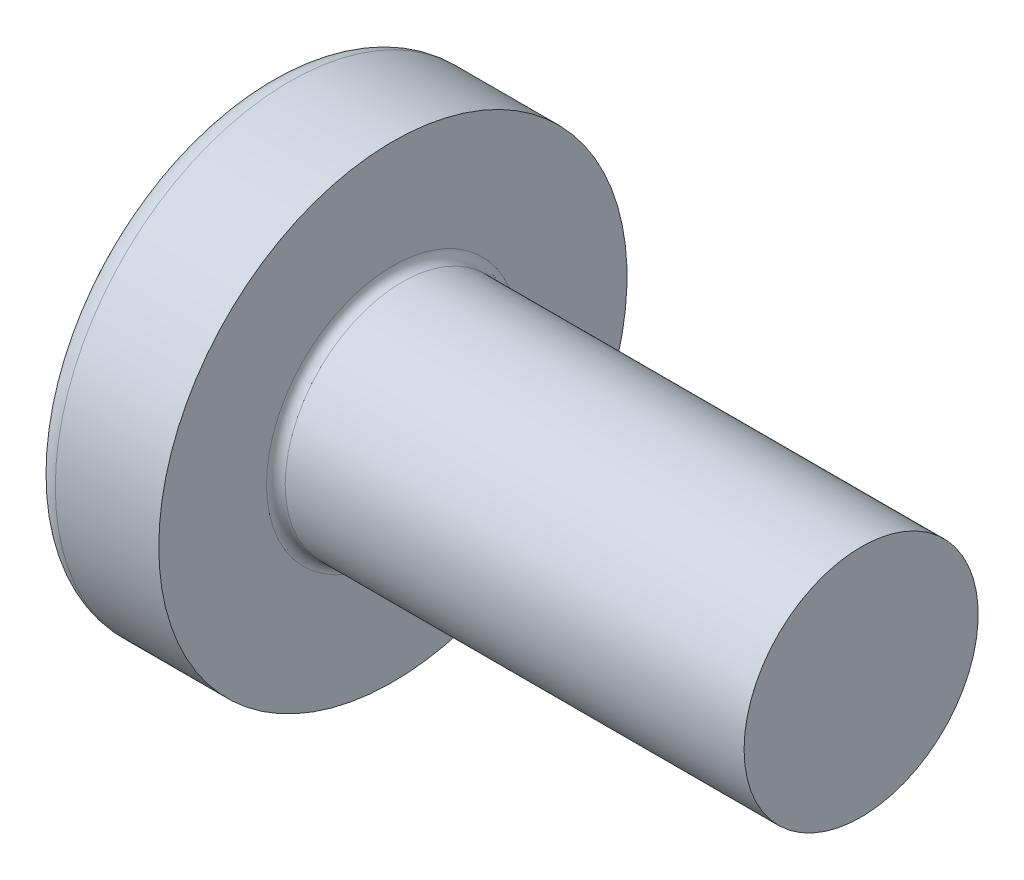
ISO-10303-21;
HEADER;
FILE_DESCRIPTION(('STEP AP214'),'2;1');
FILE_NAME('part.step','',(''),(''),'','','');
FILE_SCHEMA(('AUTOMOTIVE_DESIGN { 1 0 10303 214 1 1 1 1 }'));
ENDSEC;
DATA;
#1=APPLICATION_CONTEXT('core data for automotive mechanical design processes');
#2=APPLICATION_PROTOCOL_DEFINITION('international standard','automotive_design',2000,#1);
#3=PRODUCT_CONTEXT('',#1,'mechanical');
#4=PRODUCT('Part','Part','',(#3));
#5=PRODUCT_RELATED_PRODUCT_CATEGORY('part','',(#4));
#6=PRODUCT_DEFINITION_FORMATION('','',#4);
#7=PRODUCT_DEFINITION_CONTEXT('part definition',#1,'design');
#8=PRODUCT_DEFINITION('design','',#6,#7);
#9=PRODUCT_DEFINITION_SHAPE('','',#8);
#10=(LENGTH_UNIT() NAMED_UNIT(*) SI_UNIT(.MILLI.,.METRE.));
#11=(NAMED_UNIT(*) PLANE_ANGLE_UNIT() SI_UNIT($,.RADIAN.));
#12=(NAMED_UNIT(*) SI_UNIT($,.STERADIAN.) SOLID_ANGLE_UNIT());
#13=UNCERTAINTY_MEASURE_WITH_UNIT(LENGTH_MEASURE(1.E-05),#10,'distance_accuracy_value','');
#14=(GEOMETRIC_REPRESENTATION_CONTEXT(3) GLOBAL_UNCERTAINTY_ASSIGNED_CONTEXT((#13)) GLOBAL_UNIT_ASSIGNED_CONTEXT((#10,
#11,#12)) REPRESENTATION_CONTEXT('',''));
#15=CARTESIAN_POINT('',(0.,0.,0.));
#16=DIRECTION('',(0.,0.,1.));
#17=DIRECTION('',(1.,0.,0.));
#18=AXIS2_PLACEMENT_3D('',#15,#16,#17);
#19=CARTESIAN_POINT('',(4.,0.,0.));
#20=DIRECTION('',(-1.,0.,0.));
#21=DIRECTION('',(0.,1.,0.));
#22=AXIS2_PLACEMENT_3D('',#19,#20,#21);
#23=SPHERICAL_SURFACE('',#22,4.);
#24=CARTESIAN_POINT('',(0.803195914613464,0.,0.));
#25=DIRECTION('',(-1.,0.,0.));
#26=DIRECTION('',(0.,0.,1.));
#27=AXIS2_PLACEMENT_3D('',#24,#25,#26);
#28=CIRCLE('',#27,2.40425531914894);
#29=CARTESIAN_POINT('',(0.803195914613464,0.,2.40425531914894));
#30=VERTEX_POINT('',#29);
#31=EDGE_CURVE('E254',#30,#30,#28,.T.);
#32=ORIENTED_EDGE('',*,*,#31,.T.);
#33=EDGE_LOOP('',(#32));
#34=FACE_BOUND('',#33,.T.);
#35=CARTESIAN_POINT('',(0.0543400780062932,0.,0.));
#36=DIRECTION('',(1.,0.,0.));
#37=DIRECTION('',(0.,0.,-1.));
#38=AXIS2_PLACEMENT_3D('',#35,#36,#37);
#39=CIRCLE('',#38,0.657090389499513);
#40=CARTESIAN_POINT('',(0.054340078006295,-0.369999999999998,-0.54301729251712));
#41=VERTEX_POINT('',#40);
#42=CARTESIAN_POINT('',(0.0543400780062936,-0.543017292517118,-0.37));
#43=VERTEX_POINT('',#42);
#44=EDGE_CURVE('E435',#41,#43,#39,.F.);
#45=ORIENTED_EDGE('',*,*,#44,.F.);
#46=CARTESIAN_POINT('',(4.,-0.37,0.));
#47=DIRECTION('',(0.,1.,0.));
#48=DIRECTION('',(0.,0.,1.));
#49=AXIS2_PLACEMENT_3D('',#46,#47,#48);
#50=CIRCLE('',#49,3.98285073785097);
#51=CARTESIAN_POINT('',(0.201999111211589,-0.369999999999996,-1.19928697514917));
#52=VERTEX_POINT('',#51);
#53=EDGE_CURVE('E334',#52,#41,#50,.T.);
#54=ORIENTED_EDGE('',*,*,#53,.F.);
#55=CARTESIAN_POINT('',(3.72274328891695,0.,0.556091024961063));
#56=DIRECTION('',(0.446197753347362,0.,-0.89493439139848));
#57=DIRECTION('',(-0.89493439139848,0.,-0.446197753347362));
#58=AXIS2_PLACEMENT_3D('',#55,#56,#57);
#59=CIRCLE('',#58,3.95144169742098);
#60=CARTESIAN_POINT('',(0.201999111211589,0.370000000000004,-1.19928697514917));
#61=VERTEX_POINT('',#60);
#62=EDGE_CURVE('E296',#52,#61,#59,.T.);
#63=ORIENTED_EDGE('',*,*,#62,.T.);
#64=CARTESIAN_POINT('',(4.,0.37,0.));
#65=DIRECTION('',(0.,-1.,0.));
#66=DIRECTION('',(0.,0.,-1.));
#67=AXIS2_PLACEMENT_3D('',#64,#65,#66);
#68=CIRCLE('',#67,3.98285073785097);
#69=CARTESIAN_POINT('',(0.0543400780062934,0.370000000000002,-0.543017292517118));
#70=VERTEX_POINT('',#69);
#71=EDGE_CURVE('E367',#70,#61,#68,.T.);
#72=ORIENTED_EDGE('',*,*,#71,.F.);
#73=CARTESIAN_POINT('',(0.0543400780062936,0.543017292517118,-0.37));
#74=VERTEX_POINT('',#73);
#75=EDGE_CURVE('E482',#74,#70,#39,.F.);
#76=ORIENTED_EDGE('',*,*,#75,.F.);
#77=CARTESIAN_POINT('',(4.,0.,-0.37));
#78=DIRECTION('',(0.,0.,1.));
#79=DIRECTION('',(1.,0.,0.));
#80=AXIS2_PLACEMENT_3D('',#77,#78,#79);
#81=CIRCLE('',#80,3.98285073785097);
#82=CARTESIAN_POINT('',(0.201999111211579,1.19928697514914,-0.37));
#83=VERTEX_POINT('',#82);
#84=EDGE_CURVE('E295',#83,#74,#81,.T.);
#85=ORIENTED_EDGE('',*,*,#84,.F.);
#86=CARTESIAN_POINT('',(3.72274328891654,-0.556091024961635,0.));
#87=DIRECTION('',(0.44619775334751,0.894934391398406,0.));
#88=DIRECTION('',(-0.894934391398405,0.44619775334751,0.));
#89=AXIS2_PLACEMENT_3D('',#86,#87,#88);
#90=CIRCLE('',#89,3.95144169742087);
#91=CARTESIAN_POINT('',(0.201999111211579,1.19928697514914,0.37));
#92=VERTEX_POINT('',#91);
#93=EDGE_CURVE('E298',#83,#92,#90,.T.);
#94=ORIENTED_EDGE('',*,*,#93,.T.);
#95=CARTESIAN_POINT('',(4.,0.,0.37));
#96=DIRECTION('',(0.,0.,-1.));
#97=DIRECTION('',(0.,1.,0.));
#98=AXIS2_PLACEMENT_3D('',#95,#96,#97);
#99=CIRCLE('',#98,3.98285073785097);
#100=CARTESIAN_POINT('',(0.0543400780062932,0.543017292517113,0.37));
#101=VERTEX_POINT('',#100);
#102=EDGE_CURVE('E290',#101,#92,#99,.T.);
#103=ORIENTED_EDGE('',*,*,#102,.F.);
#104=CARTESIAN_POINT('',(0.0543400780062942,0.369999999999998,0.54301729251712));
#105=VERTEX_POINT('',#104);
#106=EDGE_CURVE('E461',#105,#101,#39,.F.);
#107=ORIENTED_EDGE('',*,*,#106,.F.);
#108=CARTESIAN_POINT('',(0.201999111211579,0.369999999999996,1.19928697514914));
#109=VERTEX_POINT('',#108);
#110=EDGE_CURVE('E314',#109,#105,#68,.T.);
#111=ORIENTED_EDGE('',*,*,#110,.F.);
#112=CARTESIAN_POINT('',(3.72274328891654,0.,-0.556091024961635));
#113=DIRECTION('',(0.44619775334751,0.,0.894934391398406));
#114=DIRECTION('',(0.894934391398405,0.,-0.44619775334751));
#115=AXIS2_PLACEMENT_3D('',#112,#113,#114);
#116=CIRCLE('',#115,3.95144169742087);
#117=CARTESIAN_POINT('',(0.201999111211579,-0.370000000000004,1.19928697514914));
#118=VERTEX_POINT('',#117);
#119=EDGE_CURVE('E61',#109,#118,#116,.T.);
#120=ORIENTED_EDGE('',*,*,#119,.T.);
#121=CARTESIAN_POINT('',(0.0543400780062943,-0.370000000000002,0.543017292517118));
#122=VERTEX_POINT('',#121);
#123=EDGE_CURVE('E308',#122,#118,#50,.T.);
#124=ORIENTED_EDGE('',*,*,#123,.F.);
#125=CARTESIAN_POINT('',(0.0543400780062932,-0.543017292517113,0.37));
#126=VERTEX_POINT('',#125);
#127=EDGE_CURVE('E469',#126,#122,#39,.F.);
#128=ORIENTED_EDGE('',*,*,#127,.F.);
#129=CARTESIAN_POINT('',(0.201999111211589,-1.19928697514917,0.37));
#130=VERTEX_POINT('',#129);
#131=EDGE_CURVE('E289',#130,#126,#99,.T.);
#132=ORIENTED_EDGE('',*,*,#131,.F.);
#133=CARTESIAN_POINT('',(3.72274328891695,0.556091024961063,0.));
#134=DIRECTION('',(0.446197753347362,-0.89493439139848,0.));
#135=DIRECTION('',(0.89493439139848,0.446197753347362,0.));
#136=AXIS2_PLACEMENT_3D('',#133,#134,#135);
#137=CIRCLE('',#136,3.95144169742098);
#138=CARTESIAN_POINT('',(0.201999111211589,-1.19928697514917,-0.37));
#139=VERTEX_POINT('',#138);
#140=EDGE_CURVE('E284',#130,#139,#137,.T.);
#141=ORIENTED_EDGE('',*,*,#140,.T.);
#142=EDGE_CURVE('E78',#43,#139,#81,.T.);
#143=ORIENTED_EDGE('',*,*,#142,.F.);
#144=EDGE_LOOP('',(#45,#54,#63,#72,#76,#85,#94,#103,#107,#111,#120,#124,#128,#132,#141,#143));
#145=FACE_BOUND('',#144,.T.);
#146=ADVANCED_FACE('F47',(#34,#145),#23,.T.);
#147=CARTESIAN_POINT('',(1.5,0.5521277129875,-0.37));
#148=DIRECTION('',(0.,0.,1.));
#149=DIRECTION('',(1.,0.,0.));
#150=AXIS2_PLACEMENT_3D('',#147,#148,#149);
#151=PLANE('',#150);
#152=ORIENTED_EDGE('',*,*,#84,.T.);
#153=CARTESIAN_POINT('',(-0.98410748766867,0.628943903399942,-0.37));
#154=CARTESIAN_POINT('',(-0.783603343008974,0.612669947295736,-0.37));
#155=CARTESIAN_POINT('',(-0.583110931104086,0.596248129681141,-0.37));
#156=CARTESIAN_POINT('',(-0.182155788452108,0.562989164841715,-0.37));
#157=CARTESIAN_POINT('',(0.0183069414735531,0.546152007726029,-0.37));
#158=CARTESIAN_POINT('',(0.419186928470486,0.511943523152247,-0.37));
#159=CARTESIAN_POINT('',(0.61960418554543,0.4945721957373,-0.37));
#160=CARTESIAN_POINT('',(1.02037173794706,0.459102589125901,-0.37));
#161=CARTESIAN_POINT('',(1.22072203423871,0.441004320904958,-0.37));
#162=CARTESIAN_POINT('',(1.53631168775258,0.411665443099266,-0.37));
#163=CARTESIAN_POINT('',(1.65158348734209,0.400774467003839,-0.37));
#164=CARTESIAN_POINT('',(1.88208360561815,0.378547148308018,-0.37));
#165=CARTESIAN_POINT('',(1.99731192452822,0.367210808029326,-0.37));
#166=CARTESIAN_POINT('',(2.22771614129237,0.343963614894723,-0.37));
#167=CARTESIAN_POINT('',(2.34289203669079,0.332052737461392,-0.37));
#168=CARTESIAN_POINT('',(2.5731581934851,0.30741320876737,-0.37));
#169=CARTESIAN_POINT('',(2.68824845325022,0.294684542317204,-0.37));
#170=CARTESIAN_POINT('',(2.80327961663798,0.281425340988554,-0.37));
#171=B_SPLINE_CURVE_WITH_KNOTS('',3,(#153,#154,#155,#156,#157,#158,#159,#160,#161,#162,#163,
#164,#165,#166,#167,#168,#169,#170),.UNSPECIFIED.,.F.,.F.,(4,2,2,2,2,2,2,2,4),(0.,
0.603490856265068,1.20699609790343,1.81050129079257,2.41399737525255,2.7613521432415,
3.1087051006963,3.45607293033825,3.80344721379854),.UNSPECIFIED.);
#172=CARTESIAN_POINT('',(1.5,0.415013252800437,-0.370000000000001));
#173=VERTEX_POINT('',#172);
#174=EDGE_CURVE('E493',#74,#173,#171,.T.);
#175=ORIENTED_EDGE('',*,*,#174,.T.);
#176=DIRECTION('',(0.,1.,0.));
#177=VECTOR('',#176,1.);
#178=CARTESIAN_POINT('',(1.5,-0.552127712987811,-0.37));
#179=LINE('',#178,#177);
#180=CARTESIAN_POINT('',(1.5,0.5521277129875,-0.37));
#181=VERTEX_POINT('',#180);
#182=EDGE_CURVE('E410',#173,#181,#179,.T.);
#183=ORIENTED_EDGE('',*,*,#182,.T.);
#184=DIRECTION('',(0.894934391398406,-0.44619775334751,0.));
#185=VECTOR('',#184,1.);
#186=CARTESIAN_POINT('',(0.,1.3,-0.37));
#187=LINE('',#186,#185);
#188=EDGE_CURVE('E258',#83,#181,#187,.T.);
#189=ORIENTED_EDGE('',*,*,#188,.F.);
#190=EDGE_LOOP('',(#152,#175,#183,#189));
#191=FACE_BOUND('',#190,.T.);
#192=ADVANCED_FACE('F206',(#191),#151,.T.);
#193=CARTESIAN_POINT('',(1.5,-0.552127712987811,-0.37));
#194=VERTEX_POINT('',#193);
#195=CARTESIAN_POINT('',(1.5,-0.415013252800437,-0.370000000000001));
#196=VERTEX_POINT('',#195);
#197=EDGE_CURVE('E270',#194,#196,#179,.T.);
#198=ORIENTED_EDGE('',*,*,#197,.T.);
#199=CARTESIAN_POINT('',(-0.98410748766867,-0.628943903399942,-0.37));
#200=CARTESIAN_POINT('',(-0.783603343008974,-0.612669947295736,-0.37));
#201=CARTESIAN_POINT('',(-0.583110931104087,-0.596248129681141,-0.37));
#202=CARTESIAN_POINT('',(-0.182155788452109,-0.562989164841715,-0.37));
#203=CARTESIAN_POINT('',(0.0183069414735524,-0.546152007726029,-0.37));
#204=CARTESIAN_POINT('',(0.419186928470486,-0.511943523152247,-0.37));
#205=CARTESIAN_POINT('',(0.619604185545429,-0.4945721957373,-0.37));
#206=CARTESIAN_POINT('',(1.02037173794705,-0.4591025891259,-0.37));
#207=CARTESIAN_POINT('',(1.22072203423871,-0.441004320904958,-0.37));
#208=CARTESIAN_POINT('',(1.53631168775258,-0.411665443099266,-0.37));
#209=CARTESIAN_POINT('',(1.65158348734209,-0.400774467003839,-0.37));
#210=CARTESIAN_POINT('',(1.88208360561815,-0.378547148308018,-0.37));
#211=CARTESIAN_POINT('',(1.99731192452822,-0.367210808029325,-0.37));
#212=CARTESIAN_POINT('',(2.22771614129237,-0.343963614894723,-0.37));
#213=CARTESIAN_POINT('',(2.34289203669079,-0.332052737461392,-0.37));
#214=CARTESIAN_POINT('',(2.5731581934851,-0.30741320876737,-0.37));
#215=CARTESIAN_POINT('',(2.68824845325022,-0.294684542317204,-0.37));
#216=CARTESIAN_POINT('',(2.80327961663798,-0.281425340988554,-0.37));
#217=B_SPLINE_CURVE_WITH_KNOTS('',3,(#199,#200,#201,#202,#203,#204,#205,#206,#207,#208,#209,
#210,#211,#212,#213,#214,#215,#216),.UNSPECIFIED.,.F.,.F.,(4,2,2,2,2,2,2,2,4),(0.,
0.603490856265068,1.20699609790343,1.81050129079257,2.41399737525255,2.7613521432415,
3.1087051006963,3.45607293033825,3.80344721379854),.UNSPECIFIED.);
#218=EDGE_CURVE('E505',#196,#43,#217,.F.);
#219=ORIENTED_EDGE('',*,*,#218,.T.);
#220=ORIENTED_EDGE('',*,*,#142,.T.);
#221=DIRECTION('',(0.89493439139848,0.446197753347362,0.));
#222=VECTOR('',#221,1.);
#223=CARTESIAN_POINT('',(0.,-1.3,-0.37));
#224=LINE('',#223,#222);
#225=EDGE_CURVE('E372',#139,#194,#224,.T.);
#226=ORIENTED_EDGE('',*,*,#225,.T.);
#227=EDGE_LOOP('',(#198,#219,#220,#226));
#228=FACE_BOUND('',#227,.T.);
#229=ADVANCED_FACE('F216',(#228),#151,.T.);
#230=CARTESIAN_POINT('',(1.5,-0.552127712987811,0.37));
#231=DIRECTION('',(0.,0.,-1.));
#232=DIRECTION('',(0.,1.,0.));
#233=AXIS2_PLACEMENT_3D('',#230,#231,#232);
#234=PLANE('',#233);
#235=DIRECTION('',(0.,-1.,0.));
#236=VECTOR('',#235,1.);
#237=CARTESIAN_POINT('',(1.5,0.5521277129875,0.37));
#238=LINE('',#237,#236);
#239=CARTESIAN_POINT('',(1.5,0.5521277129875,0.37));
#240=VERTEX_POINT('',#239);
#241=CARTESIAN_POINT('',(1.5,0.415013252800437,0.370000000000001));
#242=VERTEX_POINT('',#241);
#243=EDGE_CURVE('E383',#240,#242,#238,.T.);
#244=ORIENTED_EDGE('',*,*,#243,.T.);
#245=CARTESIAN_POINT('',(-0.984107487670368,0.62894390340008,0.37));
#246=CARTESIAN_POINT('',(-0.783603343010499,0.61266994729586,0.37));
#247=CARTESIAN_POINT('',(-0.583110931105436,0.596248129681252,0.37));
#248=CARTESIAN_POINT('',(-0.18215578845311,0.562989164841799,0.37));
#249=CARTESIAN_POINT('',(0.0183069414727262,0.5461520077261,0.37));
#250=CARTESIAN_POINT('',(0.419186928470242,0.511943523152269,0.37));
#251=CARTESIAN_POINT('',(0.619604185545593,0.494572195737286,0.37));
#252=CARTESIAN_POINT('',(1.02037173794803,0.459102589125813,0.37));
#253=CARTESIAN_POINT('',(1.22072203424009,0.441004320904832,0.37));
#254=CARTESIAN_POINT('',(1.53631168775438,0.411665443099097,0.37));
#255=CARTESIAN_POINT('',(1.65158348734388,0.400774467003668,0.37));
#256=CARTESIAN_POINT('',(1.88208360561995,0.378547148307843,0.37));
#257=CARTESIAN_POINT('',(1.99731192453001,0.367210808029148,0.37));
#258=CARTESIAN_POINT('',(2.22771614129417,0.343963614894539,0.37));
#259=CARTESIAN_POINT('',(2.34289203669258,0.332052737461204,0.37));
#260=CARTESIAN_POINT('',(2.57315819348689,0.307413208767174,0.37));
#261=CARTESIAN_POINT('',(2.68824845325201,0.294684542317003,0.37));
#262=CARTESIAN_POINT('',(2.80327961663977,0.281425340988347,0.37));
#263=B_SPLINE_CURVE_WITH_KNOTS('',3,(#245,#246,#247,#248,#249,#250,#251,#252,#253,#254,#255,
#256,#257,#258,#259,#260,#261,#262),.UNSPECIFIED.,.F.,.F.,(4,2,2,2,2,2,2,2,4),(0.,
0.603490856265592,1.20699609790448,1.81050129079485,2.41399737525605,2.76135214324501,
3.1087051006998,3.45607293034176,3.80344721380205),.UNSPECIFIED.);
#264=EDGE_CURVE('E458',#242,#101,#263,.F.);
#265=ORIENTED_EDGE('',*,*,#264,.T.);
#266=ORIENTED_EDGE('',*,*,#102,.T.);
#267=DIRECTION('',(0.894934391398405,-0.44619775334751,0.));
#268=VECTOR('',#267,1.);
#269=CARTESIAN_POINT('',(0.,1.3,0.37));
#270=LINE('',#269,#268);
#271=EDGE_CURVE('E264',#92,#240,#270,.T.);
#272=ORIENTED_EDGE('',*,*,#271,.T.);
#273=EDGE_LOOP('',(#244,#265,#266,#272));
#274=FACE_BOUND('',#273,.T.);
#275=ADVANCED_FACE('F583',(#274),#234,.T.);
#276=ORIENTED_EDGE('',*,*,#131,.T.);
#277=CARTESIAN_POINT('',(-0.984107487670367,-0.62894390340008,0.37));
#278=CARTESIAN_POINT('',(-0.783603343010497,-0.61266994729586,0.37));
#279=CARTESIAN_POINT('',(-0.583110931105435,-0.596248129681252,0.37));
#280=CARTESIAN_POINT('',(-0.182155788453109,-0.562989164841799,0.37));
#281=CARTESIAN_POINT('',(0.018306941472727,-0.546152007726099,0.37));
#282=CARTESIAN_POINT('',(0.419186928470243,-0.511943523152269,0.37));
#283=CARTESIAN_POINT('',(0.619604185545594,-0.494572195737286,0.37));
#284=CARTESIAN_POINT('',(1.02037173794803,-0.459102589125813,0.37));
#285=CARTESIAN_POINT('',(1.2207220342401,-0.441004320904832,0.37));
#286=CARTESIAN_POINT('',(1.53631168775438,-0.411665443099097,0.37));
#287=CARTESIAN_POINT('',(1.65158348734389,-0.400774467003668,0.37));
#288=CARTESIAN_POINT('',(1.88208360561995,-0.378547148307843,0.37));
#289=CARTESIAN_POINT('',(1.99731192453001,-0.367210808029148,0.37));
#290=CARTESIAN_POINT('',(2.22771614129417,-0.343963614894539,0.37));
#291=CARTESIAN_POINT('',(2.34289203669258,-0.332052737461204,0.37));
#292=CARTESIAN_POINT('',(2.57315819348689,-0.307413208767175,0.37));
#293=CARTESIAN_POINT('',(2.68824845325201,-0.294684542317003,0.37));
#294=CARTESIAN_POINT('',(2.80327961663977,-0.281425340988347,0.37));
#295=B_SPLINE_CURVE_WITH_KNOTS('',3,(#277,#278,#279,#280,#281,#282,#283,#284,#285,#286,#287,
#288,#289,#290,#291,#292,#293,#294),.UNSPECIFIED.,.F.,.F.,(4,2,2,2,2,2,2,2,4),(0.,
0.603490856265593,1.20699609790448,1.81050129079485,2.41399737525605,2.76135214324501,
3.1087051006998,3.45607293034176,3.80344721380205),.UNSPECIFIED.);
#296=CARTESIAN_POINT('',(1.5,-0.415013252800437,0.370000000000001));
#297=VERTEX_POINT('',#296);
#298=EDGE_CURVE('E472',#126,#297,#295,.T.);
#299=ORIENTED_EDGE('',*,*,#298,.T.);
#300=CARTESIAN_POINT('',(1.5,-0.552127712987811,0.37));
#301=VERTEX_POINT('',#300);
#302=EDGE_CURVE('E389',#297,#301,#238,.T.);
#303=ORIENTED_EDGE('',*,*,#302,.T.);
#304=DIRECTION('',(0.89493439139848,0.446197753347362,0.));
#305=VECTOR('',#304,1.);
#306=CARTESIAN_POINT('',(0.,-1.3,0.37));
#307=LINE('',#306,#305);
#308=EDGE_CURVE('E376',#130,#301,#307,.T.);
#309=ORIENTED_EDGE('',*,*,#308,.F.);
#310=EDGE_LOOP('',(#276,#299,#303,#309));
#311=FACE_BOUND('',#310,.T.);
#312=ADVANCED_FACE('F691',(#311),#234,.T.);
#313=CARTESIAN_POINT('',(0.,1.3,0.37));
#314=DIRECTION('',(0.44619775334751,0.894934391398406,0.));
#315=DIRECTION('',(-0.894934391398405,0.44619775334751,0.));
#316=AXIS2_PLACEMENT_3D('',#313,#314,#315);
#317=PLANE('',#316);
#318=CARTESIAN_POINT('',(2.47007552564168,0.0684659783631693,0.));
#319=DIRECTION('',(0.44619775334751,0.894934391398406,0.));
#320=DIRECTION('',(-0.894934391398406,0.44619775334751,0.));
#321=AXIS2_PLACEMENT_3D('',#318,#319,#320);
#322=ELLIPSE('',#321,1.0940568559234,0.483340636970325);
#323=CARTESIAN_POINT('',(1.5,0.552127712987502,0.0655056375527411));
#324=VERTEX_POINT('',#323);
#325=CARTESIAN_POINT('',(1.5,0.552127712987502,-0.0655056375527409));
#326=VERTEX_POINT('',#325);
#327=EDGE_CURVE('E337',#324,#326,#322,.F.);
#328=ORIENTED_EDGE('',*,*,#327,.F.);
#329=DIRECTION('',(0.,0.,-1.));
#330=VECTOR('',#329,1.);
#331=CARTESIAN_POINT('',(1.5,0.5521277129875,0.37));
#332=LINE('',#331,#330);
#333=EDGE_CURVE('E386',#240,#324,#332,.T.);
#334=ORIENTED_EDGE('',*,*,#333,.F.);
#335=ORIENTED_EDGE('',*,*,#271,.F.);
#336=ORIENTED_EDGE('',*,*,#93,.F.);
#337=ORIENTED_EDGE('',*,*,#188,.T.);
#338=EDGE_CURVE('E395',#326,#181,#332,.T.);
#339=ORIENTED_EDGE('',*,*,#338,.F.);
#340=EDGE_LOOP('',(#328,#334,#335,#336,#337,#339));
#341=FACE_BOUND('',#340,.T.);
#342=ADVANCED_FACE('F584',(#341),#317,.F.);
#343=CARTESIAN_POINT('',(0.,-1.3,-0.37));
#344=DIRECTION('',(0.446197753347362,-0.89493439139848,0.));
#345=DIRECTION('',(0.89493439139848,0.446197753347362,0.));
#346=AXIS2_PLACEMENT_3D('',#343,#344,#345);
#347=PLANE('',#346);
#348=CARTESIAN_POINT('',(2.47007552564267,-0.0684659783631887,0.));
#349=DIRECTION('',(0.446197753347362,-0.89493439139848,0.));
#350=DIRECTION('',(-0.89493439139848,-0.446197753347362,0.));
#351=AXIS2_PLACEMENT_3D('',#348,#349,#350);
#352=ELLIPSE('',#351,1.0940568559236,0.483340636970252);
#353=CARTESIAN_POINT('',(1.5,-0.552127712987812,-0.0655056375501222));
#354=VERTEX_POINT('',#353);
#355=CARTESIAN_POINT('',(1.5,-0.552127712987812,0.0655056375501221));
#356=VERTEX_POINT('',#355);
#357=EDGE_CURVE('E460',#354,#356,#352,.F.);
#358=ORIENTED_EDGE('',*,*,#357,.F.);
#359=DIRECTION('',(0.,0.,1.));
#360=VECTOR('',#359,1.);
#361=CARTESIAN_POINT('',(1.5,-0.552127712987811,-0.37));
#362=LINE('',#361,#360);
#363=EDGE_CURVE('E380',#194,#354,#362,.T.);
#364=ORIENTED_EDGE('',*,*,#363,.F.);
#365=ORIENTED_EDGE('',*,*,#225,.F.);
#366=ORIENTED_EDGE('',*,*,#140,.F.);
#367=ORIENTED_EDGE('',*,*,#308,.T.);
#368=EDGE_CURVE('E384',#356,#301,#362,.T.);
#369=ORIENTED_EDGE('',*,*,#368,.F.);
#370=EDGE_LOOP('',(#358,#364,#365,#366,#367,#369));
#371=FACE_BOUND('',#370,.T.);
#372=ADVANCED_FACE('F679',(#371),#347,.F.);
#373=CARTESIAN_POINT('',(1.5,0.5521277129875,-0.37));
#374=DIRECTION('',(-1.,0.,0.));
#375=DIRECTION('',(0.,0.,1.));
#376=AXIS2_PLACEMENT_3D('',#373,#374,#375);
#377=PLANE('',#376);
#378=DIRECTION('',(0.,1.,0.));
#379=VECTOR('',#378,1.);
#380=CARTESIAN_POINT('',(1.5,-0.370000000000002,0.552127712987499));
#381=LINE('',#380,#379);
#382=CARTESIAN_POINT('',(1.5,-0.370000000000002,0.552127712987499));
#383=VERTEX_POINT('',#382);
#384=CARTESIAN_POINT('',(1.5,-0.0655056375527541,0.5521277129875));
#385=VERTEX_POINT('',#384);
#386=EDGE_CURVE('E356',#383,#385,#381,.T.);
#387=ORIENTED_EDGE('',*,*,#386,.T.);
#388=CARTESIAN_POINT('',(1.5,0.,0.));
#389=DIRECTION('',(-1.,0.,0.));
#390=DIRECTION('',(0.,0.,1.));
#391=AXIS2_PLACEMENT_3D('',#388,#389,#390);
#392=CIRCLE('',#391,0.556);
#393=CARTESIAN_POINT('',(1.5,-0.370000000000001,0.415013252800436));
#394=VERTEX_POINT('',#393);
#395=EDGE_CURVE('E565',#394,#385,#392,.T.);
#396=ORIENTED_EDGE('',*,*,#395,.F.);
#397=DIRECTION('',(0.,0.,-1.));
#398=VECTOR('',#397,1.);
#399=CARTESIAN_POINT('',(1.5,-0.370000000000002,0.552127712987499));
#400=LINE('',#399,#398);
#401=EDGE_CURVE('E353',#383,#394,#400,.T.);
#402=ORIENTED_EDGE('',*,*,#401,.F.);
#403=EDGE_LOOP('',(#387,#396,#402));
#404=FACE_BOUND('',#403,.T.);
#405=ADVANCED_FACE('F667',(#404),#377,.T.);
#406=ORIENTED_EDGE('',*,*,#302,.F.);
#407=EDGE_CURVE('E552',#356,#297,#392,.T.);
#408=ORIENTED_EDGE('',*,*,#407,.F.);
#409=ORIENTED_EDGE('',*,*,#368,.T.);
#410=EDGE_LOOP('',(#406,#408,#409));
#411=FACE_BOUND('',#410,.T.);
#412=ADVANCED_FACE('F662',(#411),#377,.T.);
#413=ORIENTED_EDGE('',*,*,#363,.T.);
#414=EDGE_CURVE('E548',#196,#354,#392,.T.);
#415=ORIENTED_EDGE('',*,*,#414,.F.);
#416=ORIENTED_EDGE('',*,*,#197,.F.);
#417=EDGE_LOOP('',(#413,#415,#416));
#418=FACE_BOUND('',#417,.T.);
#419=ADVANCED_FACE('F652',(#418),#377,.T.);
#420=CARTESIAN_POINT('',(1.5,-0.369999999999998,-0.415013252800437));
#421=VERTEX_POINT('',#420);
#422=CARTESIAN_POINT('',(1.5,-0.369999999999998,-0.552127712987812));
#423=VERTEX_POINT('',#422);
#424=EDGE_CURVE('E359',#421,#423,#400,.T.);
#425=ORIENTED_EDGE('',*,*,#424,.F.);
#426=CARTESIAN_POINT('',(1.5,-0.0655056375501301,-0.552127712987811));
#427=VERTEX_POINT('',#426);
#428=EDGE_CURVE('E73',#427,#421,#392,.T.);
#429=ORIENTED_EDGE('',*,*,#428,.F.);
#430=DIRECTION('',(0.,-1.,0.));
#431=VECTOR('',#430,1.);
#432=CARTESIAN_POINT('',(1.5,0.370000000000002,-0.55212771298781));
#433=LINE('',#432,#431);
#434=EDGE_CURVE('E352',#427,#423,#433,.T.);
#435=ORIENTED_EDGE('',*,*,#434,.T.);
#436=EDGE_LOOP('',(#425,#429,#435));
#437=FACE_BOUND('',#436,.T.);
#438=ADVANCED_FACE('F644',(#437),#377,.T.);
#439=CARTESIAN_POINT('',(1.5,0.370000000000002,-0.55212771298781));
#440=VERTEX_POINT('',#439);
#441=CARTESIAN_POINT('',(1.5,0.065505637550134,-0.552127712987811));
#442=VERTEX_POINT('',#441);
#443=EDGE_CURVE('E347',#440,#442,#433,.T.);
#444=ORIENTED_EDGE('',*,*,#443,.T.);
#445=CARTESIAN_POINT('',(1.5,0.370000000000001,-0.415013252800436));
#446=VERTEX_POINT('',#445);
#447=EDGE_CURVE('E534',#446,#442,#392,.T.);
#448=ORIENTED_EDGE('',*,*,#447,.F.);
#449=DIRECTION('',(0.,0.,1.));
#450=VECTOR('',#449,1.);
#451=CARTESIAN_POINT('',(1.5,0.370000000000002,-0.55212771298781));
#452=LINE('',#451,#450);
#453=EDGE_CURVE('E361',#440,#446,#452,.T.);
#454=ORIENTED_EDGE('',*,*,#453,.F.);
#455=EDGE_LOOP('',(#444,#448,#454));
#456=FACE_BOUND('',#455,.T.);
#457=ADVANCED_FACE('F640',(#456),#377,.T.);
#458=ORIENTED_EDGE('',*,*,#182,.F.);
#459=EDGE_CURVE('E526',#326,#173,#392,.T.);
#460=ORIENTED_EDGE('',*,*,#459,.F.);
#461=ORIENTED_EDGE('',*,*,#338,.T.);
#462=EDGE_LOOP('',(#458,#460,#461));
#463=FACE_BOUND('',#462,.T.);
#464=ADVANCED_FACE('F627',(#463),#377,.T.);
#465=ORIENTED_EDGE('',*,*,#333,.T.);
#466=EDGE_CURVE('E518',#242,#324,#392,.T.);
#467=ORIENTED_EDGE('',*,*,#466,.F.);
#468=ORIENTED_EDGE('',*,*,#243,.F.);
#469=EDGE_LOOP('',(#465,#467,#468));
#470=FACE_BOUND('',#469,.T.);
#471=ADVANCED_FACE('F622',(#470),#377,.T.);
#472=CARTESIAN_POINT('',(1.5,0.369999999999998,0.552127712987501));
#473=DIRECTION('',(0.,-1.,0.));
#474=DIRECTION('',(1.,0.,0.));
#475=AXIS2_PLACEMENT_3D('',#472,#473,#474);
#476=PLANE('',#475);
#477=ORIENTED_EDGE('',*,*,#110,.T.);
#478=CARTESIAN_POINT('',(-0.98410748766867,0.369999999999998,0.628943903399943));
#479=CARTESIAN_POINT('',(-0.783603343008974,0.369999999999998,0.612669947295737));
#480=CARTESIAN_POINT('',(-0.583110931104087,0.369999999999998,0.596248129681142));
#481=CARTESIAN_POINT('',(-0.182155788452109,0.369999999999998,0.562989164841716));
#482=CARTESIAN_POINT('',(0.0183069414735524,0.369999999999998,0.546152007726031));
#483=CARTESIAN_POINT('',(0.419186928470486,0.369999999999998,0.511943523152249));
#484=CARTESIAN_POINT('',(0.619604185545429,0.369999999999998,0.494572195737301));
#485=CARTESIAN_POINT('',(1.02037173794705,0.369999999999998,0.459102589125902));
#486=CARTESIAN_POINT('',(1.22072203423871,0.369999999999998,0.44100432090496));
#487=CARTESIAN_POINT('',(1.53631168775258,0.369999999999999,0.411665443099267));
#488=CARTESIAN_POINT('',(1.65158348734209,0.369999999999999,0.40077446700384));
#489=CARTESIAN_POINT('',(1.88208360561815,0.369999999999999,0.37854714830802));
#490=CARTESIAN_POINT('',(1.99731192452821,0.369999999999999,0.367210808029327));
#491=CARTESIAN_POINT('',(2.22771614129237,0.369999999999999,0.343963614894724));
#492=CARTESIAN_POINT('',(2.34289203669079,0.369999999999999,0.332052737461393));
#493=CARTESIAN_POINT('',(2.5731581934851,0.369999999999999,0.307413208767372));
#494=CARTESIAN_POINT('',(2.68824845325022,0.369999999999999,0.294684542317205));
#495=CARTESIAN_POINT('',(2.80327961663798,0.369999999999999,0.281425340988555));
#496=B_SPLINE_CURVE_WITH_KNOTS('',3,(#478,#479,#480,#481,#482,#483,#484,#485,#486,#487,#488,
#489,#490,#491,#492,#493,#494,#495),.UNSPECIFIED.,.F.,.F.,(4,2,2,2,2,2,2,2,4),(0.,
0.603490856265068,1.20699609790343,1.81050129079257,2.41399737525255,2.7613521432415,
3.1087051006963,3.45607293033825,3.80344721379854),.UNSPECIFIED.);
#497=CARTESIAN_POINT('',(1.5,0.369999999999999,0.415013252800439));
#498=VERTEX_POINT('',#497);
#499=EDGE_CURVE('E468',#105,#498,#496,.T.);
#500=ORIENTED_EDGE('',*,*,#499,.T.);
#501=CARTESIAN_POINT('',(1.5,0.369999999999998,0.552127712987501));
#502=VERTEX_POINT('',#501);
#503=EDGE_CURVE('E328',#498,#502,#452,.T.);
#504=ORIENTED_EDGE('',*,*,#503,.T.);
#505=DIRECTION('',(0.894934391398406,0.,-0.44619775334751));
#506=VECTOR('',#505,1.);
#507=CARTESIAN_POINT('',(0.,0.369999999999995,1.3));
#508=LINE('',#507,#506);
#509=EDGE_CURVE('E323',#109,#502,#508,.T.);
#510=ORIENTED_EDGE('',*,*,#509,.F.);
#511=EDGE_LOOP('',(#477,#500,#504,#510));
#512=FACE_BOUND('',#511,.T.);
#513=ADVANCED_FACE('F321',(#512),#476,.T.);
#514=CARTESIAN_POINT('',(1.5,-0.369999999999998,-0.552127712987812));
#515=DIRECTION('',(0.,1.,0.));
#516=DIRECTION('',(0.,0.,1.));
#517=AXIS2_PLACEMENT_3D('',#514,#515,#516);
#518=PLANE('',#517);
#519=ORIENTED_EDGE('',*,*,#401,.T.);
#520=CARTESIAN_POINT('',(-0.98410748766867,-0.370000000000002,0.62894390339994));
#521=CARTESIAN_POINT('',(-0.783603343008974,-0.370000000000002,0.612669947295735));
#522=CARTESIAN_POINT('',(-0.583110931104086,-0.370000000000002,0.59624812968114));
#523=CARTESIAN_POINT('',(-0.182155788452109,-0.370000000000002,0.562989164841714));
#524=CARTESIAN_POINT('',(0.0183069414735528,-0.370000000000002,0.546152007726028));
#525=CARTESIAN_POINT('',(0.419186928470486,-0.370000000000002,0.511943523152246));
#526=CARTESIAN_POINT('',(0.61960418554543,-0.370000000000002,0.494572195737299));
#527=CARTESIAN_POINT('',(1.02037173794706,-0.370000000000001,0.459102589125899));
#528=CARTESIAN_POINT('',(1.22072203423871,-0.370000000000001,0.441004320904957));
#529=CARTESIAN_POINT('',(1.53631168775258,-0.370000000000001,0.411665443099264));
#530=CARTESIAN_POINT('',(1.65158348734209,-0.370000000000001,0.400774467003838));
#531=CARTESIAN_POINT('',(1.88208360561815,-0.370000000000001,0.378547148308017));
#532=CARTESIAN_POINT('',(1.99731192452822,-0.370000000000001,0.367210808029324));
#533=CARTESIAN_POINT('',(2.22771614129237,-0.370000000000001,0.343963614894722));
#534=CARTESIAN_POINT('',(2.34289203669079,-0.370000000000001,0.33205273746139));
#535=CARTESIAN_POINT('',(2.5731581934851,-0.370000000000001,0.307413208767369));
#536=CARTESIAN_POINT('',(2.68824845325022,-0.370000000000001,0.294684542317202));
#537=CARTESIAN_POINT('',(2.80327961663798,-0.370000000000001,0.281425340988552));
#538=B_SPLINE_CURVE_WITH_KNOTS('',3,(#520,#521,#522,#523,#524,#525,#526,#527,#528,#529,#530,
#531,#532,#533,#534,#535,#536,#537),.UNSPECIFIED.,.F.,.F.,(4,2,2,2,2,2,2,2,4),(0.,
0.603490856265068,1.20699609790343,1.81050129079257,2.41399737525255,2.7613521432415,
3.1087051006963,3.45607293033825,3.80344721379854),.UNSPECIFIED.);
#539=EDGE_CURVE('E483',#394,#122,#538,.F.);
#540=ORIENTED_EDGE('',*,*,#539,.T.);
#541=ORIENTED_EDGE('',*,*,#123,.T.);
#542=DIRECTION('',(0.894934391398405,0.,-0.44619775334751));
#543=VECTOR('',#542,1.);
#544=CARTESIAN_POINT('',(0.,-0.370000000000005,1.3));
#545=LINE('',#544,#543);
#546=EDGE_CURVE('E322',#118,#383,#545,.T.);
#547=ORIENTED_EDGE('',*,*,#546,.T.);
#548=EDGE_LOOP('',(#519,#540,#541,#547));
#549=FACE_BOUND('',#548,.T.);
#550=ADVANCED_FACE('F244',(#549),#518,.T.);
#551=CARTESIAN_POINT('',(0.,-0.370000000000005,1.3));
#552=DIRECTION('',(0.44619775334751,0.,0.894934391398406));
#553=DIRECTION('',(-0.894934391398405,0.,0.44619775334751));
#554=AXIS2_PLACEMENT_3D('',#551,#552,#553);
#555=PLANE('',#554);
#556=CARTESIAN_POINT('',(2.47007552564168,0.,0.0684659783631693));
#557=DIRECTION('',(0.44619775334751,0.,0.894934391398406));
#558=DIRECTION('',(-0.894934391398406,0.,0.44619775334751));
#559=AXIS2_PLACEMENT_3D('',#556,#557,#558);
#560=ELLIPSE('',#559,1.0940568559234,0.483340636970325);
#561=CARTESIAN_POINT('',(1.5,0.0655056375527502,0.552127712987501));
#562=VERTEX_POINT('',#561);
#563=EDGE_CURVE('E488',#385,#562,#560,.F.);
#564=ORIENTED_EDGE('',*,*,#563,.F.);
#565=ORIENTED_EDGE('',*,*,#386,.F.);
#566=ORIENTED_EDGE('',*,*,#546,.F.);
#567=ORIENTED_EDGE('',*,*,#119,.F.);
#568=ORIENTED_EDGE('',*,*,#509,.T.);
#569=EDGE_CURVE('E364',#562,#502,#381,.T.);
#570=ORIENTED_EDGE('',*,*,#569,.F.);
#571=EDGE_LOOP('',(#564,#565,#566,#567,#568,#570));
#572=FACE_BOUND('',#571,.T.);
#573=ADVANCED_FACE('F317',(#572),#555,.F.);
#574=CARTESIAN_POINT('',(0.,0.370000000000005,-1.3));
#575=DIRECTION('',(0.446197753347362,0.,-0.89493439139848));
#576=DIRECTION('',(0.89493439139848,0.,0.446197753347362));
#577=AXIS2_PLACEMENT_3D('',#574,#575,#576);
#578=PLANE('',#577);
#579=CARTESIAN_POINT('',(2.47007552564267,0.,-0.0684659783631887));
#580=DIRECTION('',(0.446197753347362,0.,-0.89493439139848));
#581=DIRECTION('',(-0.89493439139848,0.,-0.446197753347362));
#582=AXIS2_PLACEMENT_3D('',#579,#580,#581);
#583=ELLIPSE('',#582,1.0940568559236,0.483340636970252);
#584=EDGE_CURVE('E438',#442,#427,#583,.F.);
#585=ORIENTED_EDGE('',*,*,#584,.F.);
#586=ORIENTED_EDGE('',*,*,#443,.F.);
#587=DIRECTION('',(0.89493439139848,0.,0.446197753347362));
#588=VECTOR('',#587,1.);
#589=CARTESIAN_POINT('',(0.,0.370000000000005,-1.3));
#590=LINE('',#589,#588);
#591=EDGE_CURVE('E340',#61,#440,#590,.T.);
#592=ORIENTED_EDGE('',*,*,#591,.F.);
#593=ORIENTED_EDGE('',*,*,#62,.F.);
#594=DIRECTION('',(0.89493439139848,0.,0.446197753347362));
#595=VECTOR('',#594,1.);
#596=CARTESIAN_POINT('',(0.,-0.369999999999995,-1.3));
#597=LINE('',#596,#595);
#598=EDGE_CURVE('E344',#52,#423,#597,.T.);
#599=ORIENTED_EDGE('',*,*,#598,.T.);
#600=ORIENTED_EDGE('',*,*,#434,.F.);
#601=EDGE_LOOP('',(#585,#586,#592,#593,#599,#600));
#602=FACE_BOUND('',#601,.T.);
#603=ADVANCED_FACE('F430',(#602),#578,.F.);
#604=ORIENTED_EDGE('',*,*,#453,.T.);
#605=CARTESIAN_POINT('',(-0.984107487670367,0.370000000000002,-0.628943903400078));
#606=CARTESIAN_POINT('',(-0.783603343010497,0.370000000000002,-0.612669947295859));
#607=CARTESIAN_POINT('',(-0.583110931105435,0.370000000000002,-0.596248129681251));
#608=CARTESIAN_POINT('',(-0.182155788453109,0.370000000000002,-0.562989164841798));
#609=CARTESIAN_POINT('',(0.0183069414727269,0.370000000000002,-0.546152007726098));
#610=CARTESIAN_POINT('',(0.419186928470243,0.370000000000002,-0.511943523152268));
#611=CARTESIAN_POINT('',(0.619604185545594,0.370000000000002,-0.494572195737285));
#612=CARTESIAN_POINT('',(1.02037173794803,0.370000000000002,-0.459102589125812));
#613=CARTESIAN_POINT('',(1.2207220342401,0.370000000000001,-0.441004320904831));
#614=CARTESIAN_POINT('',(1.53631168775438,0.370000000000001,-0.411665443099096));
#615=CARTESIAN_POINT('',(1.65158348734389,0.370000000000001,-0.400774467003667));
#616=CARTESIAN_POINT('',(1.88208360561995,0.370000000000001,-0.378547148307842));
#617=CARTESIAN_POINT('',(1.99731192453001,0.370000000000001,-0.367210808029146));
#618=CARTESIAN_POINT('',(2.22771614129417,0.370000000000001,-0.343963614894538));
#619=CARTESIAN_POINT('',(2.34289203669258,0.370000000000001,-0.332052737461203));
#620=CARTESIAN_POINT('',(2.57315819348689,0.370000000000001,-0.307413208767173));
#621=CARTESIAN_POINT('',(2.68824845325201,0.370000000000001,-0.294684542317002));
#622=CARTESIAN_POINT('',(2.80327961663977,0.370000000000001,-0.281425340988346));
#623=B_SPLINE_CURVE_WITH_KNOTS('',3,(#605,#606,#607,#608,#609,#610,#611,#612,#613,#614,#615,
#616,#617,#618,#619,#620,#621,#622),.UNSPECIFIED.,.F.,.F.,(4,2,2,2,2,2,2,2,4),(0.,
0.603490856265593,1.20699609790448,1.81050129079485,2.41399737525605,2.76135214324501,
3.1087051006998,3.45607293034176,3.80344721380205),.UNSPECIFIED.);
#624=EDGE_CURVE('E423',#446,#70,#623,.F.);
#625=ORIENTED_EDGE('',*,*,#624,.T.);
#626=ORIENTED_EDGE('',*,*,#71,.T.);
#627=ORIENTED_EDGE('',*,*,#591,.T.);
#628=EDGE_LOOP('',(#604,#625,#626,#627));
#629=FACE_BOUND('',#628,.T.);
#630=ADVANCED_FACE('F243',(#629),#476,.T.);
#631=ORIENTED_EDGE('',*,*,#53,.T.);
#632=CARTESIAN_POINT('',(-0.98410748766867,-0.369999999999997,-0.628943903399943));
#633=CARTESIAN_POINT('',(-0.783603343008974,-0.369999999999998,-0.612669947295737));
#634=CARTESIAN_POINT('',(-0.583110931104086,-0.369999999999998,-0.596248129681142));
#635=CARTESIAN_POINT('',(-0.182155788452109,-0.369999999999998,-0.562989164841716));
#636=CARTESIAN_POINT('',(0.0183069414735524,-0.369999999999998,-0.546152007726031));
#637=CARTESIAN_POINT('',(0.419186928470486,-0.369999999999998,-0.511943523152249));
#638=CARTESIAN_POINT('',(0.619604185545429,-0.369999999999998,-0.494572195737301));
#639=CARTESIAN_POINT('',(1.02037173794705,-0.369999999999998,-0.459102589125902));
#640=CARTESIAN_POINT('',(1.22072203423871,-0.369999999999998,-0.441004320904959));
#641=CARTESIAN_POINT('',(1.53631168775258,-0.369999999999998,-0.411665443099267));
#642=CARTESIAN_POINT('',(1.65158348734209,-0.369999999999998,-0.40077446700384));
#643=CARTESIAN_POINT('',(1.88208360561815,-0.369999999999999,-0.37854714830802));
#644=CARTESIAN_POINT('',(1.99731192452822,-0.369999999999999,-0.367210808029327));
#645=CARTESIAN_POINT('',(2.22771614129237,-0.369999999999999,-0.343963614894724));
#646=CARTESIAN_POINT('',(2.34289203669079,-0.369999999999999,-0.332052737461393));
#647=CARTESIAN_POINT('',(2.5731581934851,-0.369999999999999,-0.307413208767372));
#648=CARTESIAN_POINT('',(2.68824845325022,-0.369999999999999,-0.294684542317205));
#649=CARTESIAN_POINT('',(2.80327961663798,-0.369999999999999,-0.281425340988555));
#650=B_SPLINE_CURVE_WITH_KNOTS('',3,(#632,#633,#634,#635,#636,#637,#638,#639,#640,#641,#642,
#643,#644,#645,#646,#647,#648,#649),.UNSPECIFIED.,.F.,.F.,(4,2,2,2,2,2,2,2,4),(0.,
0.603490856265068,1.20699609790343,1.81050129079257,2.41399737525255,2.7613521432415,
3.1087051006963,3.45607293033825,3.80344721379854),.UNSPECIFIED.);
#651=EDGE_CURVE('E11',#41,#421,#650,.T.);
#652=ORIENTED_EDGE('',*,*,#651,.T.);
#653=ORIENTED_EDGE('',*,*,#424,.T.);
#654=ORIENTED_EDGE('',*,*,#598,.F.);
#655=EDGE_LOOP('',(#631,#652,#653,#654));
#656=FACE_BOUND('',#655,.T.);
#657=ADVANCED_FACE('F239',(#656),#518,.T.);
#658=CARTESIAN_POINT('',(-25.4,0.,0.));
#659=DIRECTION('',(-1.,0.,0.));
#660=DIRECTION('',(0.,0.,1.));
#661=AXIS2_PLACEMENT_3D('',#658,#659,#660);
#662=CYLINDRICAL_SURFACE('',#661,1.25);
#663=CARTESIAN_POINT('',(2.2,0.,0.));
#664=DIRECTION('',(-1.,0.,0.));
#665=DIRECTION('',(0.,0.,1.));
#666=AXIS2_PLACEMENT_3D('',#663,#664,#665);
#667=CIRCLE('',#666,1.25);
#668=CARTESIAN_POINT('',(2.2,0.,1.25));
#669=VERTEX_POINT('',#668);
#670=EDGE_CURVE('E250',#669,#669,#667,.F.);
#671=ORIENTED_EDGE('',*,*,#670,.T.);
#672=EDGE_LOOP('',(#671));
#673=FACE_BOUND('',#672,.T.);
#674=CARTESIAN_POINT('',(7.1,0.,0.));
#675=DIRECTION('',(-1.,0.,0.));
#676=DIRECTION('',(0.,0.,1.));
#677=AXIS2_PLACEMENT_3D('',#674,#675,#676);
#678=CIRCLE('',#677,1.25);
#679=CARTESIAN_POINT('',(7.1,0.,1.25));
#680=VERTEX_POINT('',#679);
#681=EDGE_CURVE('E255',#680,#680,#678,.T.);
#682=ORIENTED_EDGE('',*,*,#681,.T.);
#683=EDGE_LOOP('',(#682));
#684=FACE_BOUND('',#683,.T.);
#685=ADVANCED_FACE('F233',(#673,#684),#662,.T.);
#686=CARTESIAN_POINT('',(2.1,1.25,0.));
#687=DIRECTION('',(-1.,0.,0.));
#688=DIRECTION('',(0.,0.,1.));
#689=AXIS2_PLACEMENT_3D('',#686,#687,#688);
#690=PLANE('',#689);
#691=CARTESIAN_POINT('',(2.1,0.,0.));
#692=DIRECTION('',(-1.,0.,0.));
#693=DIRECTION('',(0.,0.,1.));
#694=AXIS2_PLACEMENT_3D('',#691,#692,#693);
#695=CIRCLE('',#694,1.35);
#696=CARTESIAN_POINT('',(2.1,0.,1.35));
#697=VERTEX_POINT('',#696);
#698=EDGE_CURVE('E280',#697,#697,#695,.T.);
#699=ORIENTED_EDGE('',*,*,#698,.T.);
#700=EDGE_LOOP('',(#699));
#701=FACE_BOUND('',#700,.T.);
#702=CARTESIAN_POINT('',(2.1,0.,0.));
#703=DIRECTION('',(-1.,0.,0.));
#704=DIRECTION('',(0.,0.,1.));
#705=AXIS2_PLACEMENT_3D('',#702,#703,#704);
#706=CIRCLE('',#705,2.5);
#707=CARTESIAN_POINT('',(2.1,0.,2.5));
#708=VERTEX_POINT('',#707);
#709=EDGE_CURVE('E273',#708,#708,#706,.T.);
#710=ORIENTED_EDGE('',*,*,#709,.F.);
#711=EDGE_LOOP('',(#710));
#712=FACE_BOUND('',#711,.T.);
#713=ADVANCED_FACE('F235',(#701,#712),#690,.F.);
#714=CARTESIAN_POINT('',(-25.4,0.,0.));
#715=DIRECTION('',(-1.,0.,0.));
#716=DIRECTION('',(0.,0.,1.));
#717=AXIS2_PLACEMENT_3D('',#714,#715,#716);
#718=CYLINDRICAL_SURFACE('',#717,2.5);
#719=ORIENTED_EDGE('',*,*,#709,.T.);
#720=EDGE_LOOP('',(#719));
#721=FACE_BOUND('',#720,.T.);
#722=CARTESIAN_POINT('',(0.995004159736655,0.,0.));
#723=DIRECTION('',(-1.,0.,0.));
#724=DIRECTION('',(0.,0.,1.));
#725=AXIS2_PLACEMENT_3D('',#722,#723,#724);
#726=CIRCLE('',#725,2.5);
#727=CARTESIAN_POINT('',(0.995004159736655,0.,2.5));
#728=VERTEX_POINT('',#727);
#729=EDGE_CURVE('E263',#728,#728,#726,.T.);
#730=ORIENTED_EDGE('',*,*,#729,.F.);
#731=EDGE_LOOP('',(#730));
#732=FACE_BOUND('',#731,.T.);
#733=ADVANCED_FACE('F229',(#721,#732),#718,.T.);
#734=CARTESIAN_POINT('',(0.995004159736656,0.,0.));
#735=DIRECTION('',(-1.,0.,0.));
#736=DIRECTION('',(0.,0.,1.));
#737=AXIS2_PLACEMENT_3D('',#734,#735,#736);
#738=TOROIDAL_SURFACE('',#737,2.26,0.24);
#739=ORIENTED_EDGE('',*,*,#729,.T.);
#740=EDGE_LOOP('',(#739));
#741=FACE_BOUND('',#740,.T.);
#742=ORIENTED_EDGE('',*,*,#31,.F.);
#743=EDGE_LOOP('',(#742));
#744=FACE_BOUND('',#743,.T.);
#745=ADVANCED_FACE('F221',(#741,#744),#738,.T.);
#746=CARTESIAN_POINT('',(7.1,1.25,0.));
#747=DIRECTION('',(1.,0.,0.));
#748=DIRECTION('',(0.,0.,-1.));
#749=AXIS2_PLACEMENT_3D('',#746,#747,#748);
#750=PLANE('',#749);
#751=ORIENTED_EDGE('',*,*,#681,.F.);
#752=EDGE_LOOP('',(#751));
#753=FACE_BOUND('',#752,.T.);
#754=ADVANCED_FACE('F222',(#753),#750,.T.);
#755=CARTESIAN_POINT('',(2.2,0.,0.));
#756=DIRECTION('',(-1.,0.,0.));
#757=DIRECTION('',(0.,0.,1.));
#758=AXIS2_PLACEMENT_3D('',#755,#756,#757);
#759=TOROIDAL_SURFACE('',#758,1.35,0.1);
#760=ORIENTED_EDGE('',*,*,#670,.F.);
#761=EDGE_LOOP('',(#760));
#762=FACE_BOUND('',#761,.T.);
#763=ORIENTED_EDGE('',*,*,#698,.F.);
#764=EDGE_LOOP('',(#763));
#765=FACE_BOUND('',#764,.T.);
#766=ADVANCED_FACE('F51',(#762,#765),#759,.F.);
#767=ORIENTED_EDGE('',*,*,#503,.F.);
#768=EDGE_CURVE('E506',#562,#498,#392,.T.);
#769=ORIENTED_EDGE('',*,*,#768,.F.);
#770=ORIENTED_EDGE('',*,*,#569,.T.);
#771=EDGE_LOOP('',(#767,#769,#770));
#772=FACE_BOUND('',#771,.T.);
#773=ADVANCED_FACE('F629',(#772),#377,.T.);
#774=CARTESIAN_POINT('',(1.5,0.,0.));
#775=DIRECTION('',(-1.,0.,0.));
#776=DIRECTION('',(0.,0.,1.));
#777=AXIS2_PLACEMENT_3D('',#774,#775,#776);
#778=CONICAL_SURFACE('',#777,0.556,0.069813170079766);
#779=ORIENTED_EDGE('',*,*,#327,.T.);
#780=EDGE_CURVE('E524',#324,#326,#392,.T.);
#781=ORIENTED_EDGE('',*,*,#780,.F.);
#782=EDGE_LOOP('',(#779,#781));
#783=FACE_BOUND('',#782,.T.);
#784=ADVANCED_FACE('F207',(#783),#778,.F.);
#785=ORIENTED_EDGE('',*,*,#357,.T.);
#786=EDGE_CURVE('E546',#354,#356,#392,.T.);
#787=ORIENTED_EDGE('',*,*,#786,.F.);
#788=EDGE_LOOP('',(#785,#787));
#789=FACE_BOUND('',#788,.T.);
#790=ADVANCED_FACE('F729',(#789),#778,.F.);
#791=EDGE_CURVE('E515',#498,#242,#392,.T.);
#792=ORIENTED_EDGE('',*,*,#791,.F.);
#793=ORIENTED_EDGE('',*,*,#499,.F.);
#794=ORIENTED_EDGE('',*,*,#106,.T.);
#795=ORIENTED_EDGE('',*,*,#264,.F.);
#796=EDGE_LOOP('',(#792,#793,#794,#795));
#797=FACE_BOUND('',#796,.T.);
#798=ADVANCED_FACE('F738',(#797),#778,.F.);
#799=ORIENTED_EDGE('',*,*,#563,.T.);
#800=EDGE_CURVE('E511',#385,#562,#392,.T.);
#801=ORIENTED_EDGE('',*,*,#800,.F.);
#802=EDGE_LOOP('',(#799,#801));
#803=FACE_BOUND('',#802,.T.);
#804=ADVANCED_FACE('F750',(#803),#778,.F.);
#805=ORIENTED_EDGE('',*,*,#584,.T.);
#806=EDGE_CURVE('E539',#442,#427,#392,.T.);
#807=ORIENTED_EDGE('',*,*,#806,.F.);
#808=EDGE_LOOP('',(#805,#807));
#809=FACE_BOUND('',#808,.T.);
#810=ADVANCED_FACE('F756',(#809),#778,.F.);
#811=ORIENTED_EDGE('',*,*,#127,.T.);
#812=ORIENTED_EDGE('',*,*,#539,.F.);
#813=EDGE_CURVE('E556',#297,#394,#392,.T.);
#814=ORIENTED_EDGE('',*,*,#813,.F.);
#815=ORIENTED_EDGE('',*,*,#298,.F.);
#816=EDGE_LOOP('',(#811,#812,#814,#815));
#817=FACE_BOUND('',#816,.T.);
#818=ADVANCED_FACE('F770',(#817),#778,.F.);
#819=ORIENTED_EDGE('',*,*,#75,.T.);
#820=ORIENTED_EDGE('',*,*,#624,.F.);
#821=EDGE_CURVE('E530',#173,#446,#392,.T.);
#822=ORIENTED_EDGE('',*,*,#821,.F.);
#823=ORIENTED_EDGE('',*,*,#174,.F.);
#824=EDGE_LOOP('',(#819,#820,#822,#823));
#825=FACE_BOUND('',#824,.T.);
#826=ADVANCED_FACE('F203',(#825),#778,.F.);
#827=EDGE_CURVE('E543',#421,#196,#392,.T.);
#828=ORIENTED_EDGE('',*,*,#827,.F.);
#829=ORIENTED_EDGE('',*,*,#651,.F.);
#830=ORIENTED_EDGE('',*,*,#44,.T.);
#831=ORIENTED_EDGE('',*,*,#218,.F.);
#832=EDGE_LOOP('',(#828,#829,#830,#831));
#833=FACE_BOUND('',#832,.T.);
#834=ADVANCED_FACE('F197',(#833),#778,.F.);
#835=CARTESIAN_POINT('',(1.68065535110549,0.,0.));
#836=DIRECTION('',(-1.,0.,0.));
#837=DIRECTION('',(0.,0.,1.));
#838=AXIS2_PLACEMENT_3D('',#835,#836,#837);
#839=CONICAL_SURFACE('',#838,0.,1.25663706143592);
#840=ORIENTED_EDGE('',*,*,#768,.T.);
#841=ORIENTED_EDGE('',*,*,#791,.T.);
#842=ORIENTED_EDGE('',*,*,#466,.T.);
#843=ORIENTED_EDGE('',*,*,#780,.T.);
#844=ORIENTED_EDGE('',*,*,#459,.T.);
#845=ORIENTED_EDGE('',*,*,#821,.T.);
#846=ORIENTED_EDGE('',*,*,#447,.T.);
#847=ORIENTED_EDGE('',*,*,#806,.T.);
#848=ORIENTED_EDGE('',*,*,#428,.T.);
#849=ORIENTED_EDGE('',*,*,#827,.T.);
#850=ORIENTED_EDGE('',*,*,#414,.T.);
#851=ORIENTED_EDGE('',*,*,#786,.T.);
#852=ORIENTED_EDGE('',*,*,#407,.T.);
#853=ORIENTED_EDGE('',*,*,#813,.T.);
#854=ORIENTED_EDGE('',*,*,#395,.T.);
#855=ORIENTED_EDGE('',*,*,#800,.T.);
#856=EDGE_LOOP('',(#840,#841,#842,#843,#844,#845,#846,#847,#848,#849,#850,#851,#852,#853,#854,#855));
#857=FACE_BOUND('',#856,.T.);
#858=CARTESIAN_POINT('',(1.68065535110549,0.,0.));
#859=VERTEX_POINT('',#858);
#860=VERTEX_LOOP('',#859);
#861=FACE_BOUND('',#860,.T.);
#862=ADVANCED_FACE('F200',(#857,#861),#839,.F.);
#863=CLOSED_SHELL('',(#146,#192,#229,#275,#312,#342,#372,#405,#412,#419,#438,#457,#464,#471,
#513,#550,#573,#603,#630,#657,#685,#713,#733,#745,#754,#766,#773,#784,#790,#798,#804,#810,#818,
#826,#834,#862));
#864=MANIFOLD_SOLID_BREP('B2',#863);
#865=ADVANCED_BREP_SHAPE_REPRESENTATION('',(#18,#864),#14);
#866=SHAPE_DEFINITION_REPRESENTATION(#9,#865);
ENDSEC;
END-ISO-10303-21;
